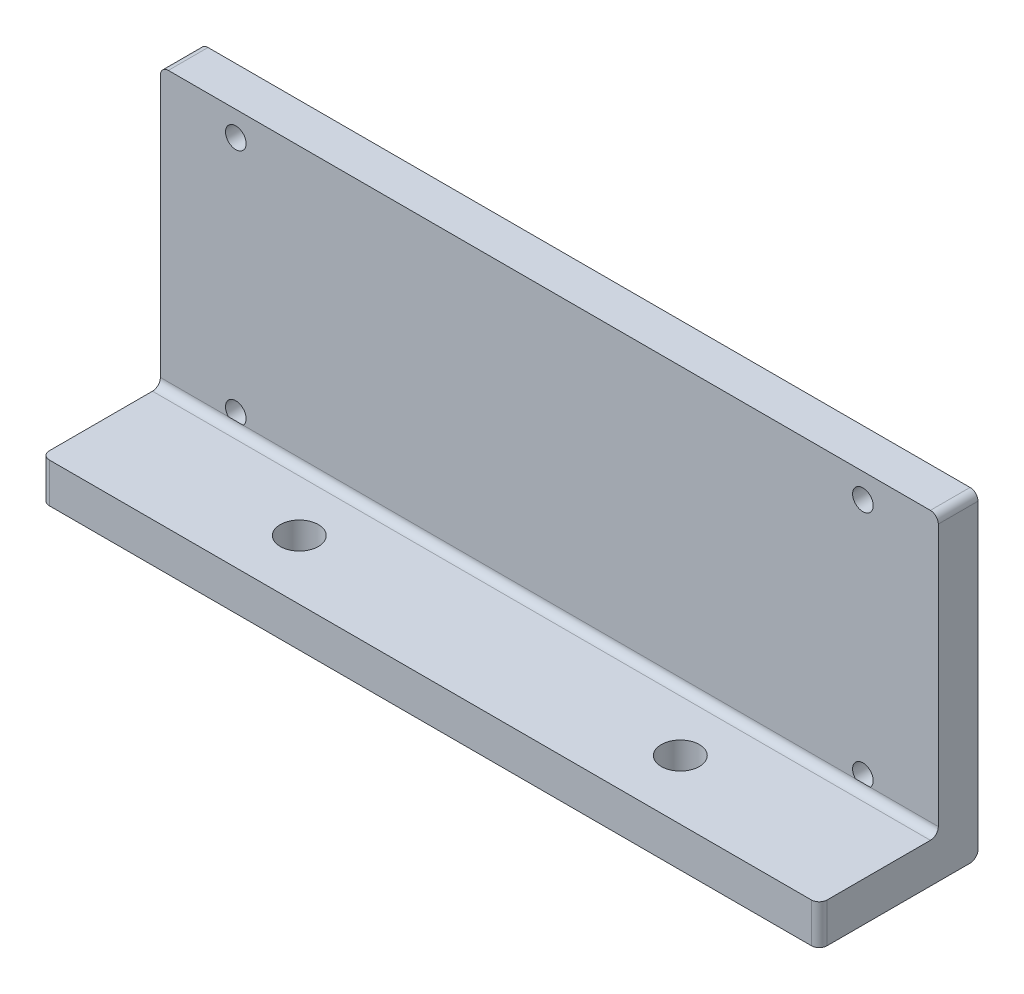
ISO-10303-21;
HEADER;
FILE_DESCRIPTION(('STEP AP214'),'2;1');
FILE_NAME('part.step','',(''),(''),'','','');
FILE_SCHEMA(('AUTOMOTIVE_DESIGN { 1 0 10303 214 1 1 1 1 }'));
ENDSEC;
DATA;
#1=APPLICATION_CONTEXT('core data for automotive mechanical design processes');
#2=APPLICATION_PROTOCOL_DEFINITION('international standard','automotive_design',2000,#1);
#3=PRODUCT_CONTEXT('',#1,'mechanical');
#4=PRODUCT('Part','Part','',(#3));
#5=PRODUCT_RELATED_PRODUCT_CATEGORY('part','',(#4));
#6=PRODUCT_DEFINITION_FORMATION('','',#4);
#7=PRODUCT_DEFINITION_CONTEXT('part definition',#1,'design');
#8=PRODUCT_DEFINITION('design','',#6,#7);
#9=PRODUCT_DEFINITION_SHAPE('','',#8);
#10=(LENGTH_UNIT() NAMED_UNIT(*) SI_UNIT(.MILLI.,.METRE.));
#11=(NAMED_UNIT(*) PLANE_ANGLE_UNIT() SI_UNIT($,.RADIAN.));
#12=(NAMED_UNIT(*) SI_UNIT($,.STERADIAN.) SOLID_ANGLE_UNIT());
#13=UNCERTAINTY_MEASURE_WITH_UNIT(LENGTH_MEASURE(1.E-05),#10,'distance_accuracy_value','');
#14=(GEOMETRIC_REPRESENTATION_CONTEXT(3) GLOBAL_UNCERTAINTY_ASSIGNED_CONTEXT((#13)) GLOBAL_UNIT_ASSIGNED_CONTEXT((#10,
#11,#12)) REPRESENTATION_CONTEXT('',''));
#15=CARTESIAN_POINT('',(0.,0.,0.));
#16=DIRECTION('',(0.,0.,1.));
#17=DIRECTION('',(1.,0.,0.));
#18=AXIS2_PLACEMENT_3D('',#15,#16,#17);
#19=CARTESIAN_POINT('',(0.,5.,0.));
#20=DIRECTION('',(0.,-1.,0.));
#21=DIRECTION('',(0.,0.,-1.));
#22=AXIS2_PLACEMENT_3D('',#19,#20,#21);
#23=PLANE('',#22);
#24=CARTESIAN_POINT('',(-24.,5.,2.5));
#25=DIRECTION('',(0.,1.,0.));
#26=DIRECTION('',(0.,0.,1.));
#27=AXIS2_PLACEMENT_3D('',#24,#25,#26);
#28=CIRCLE('',#27,2.4);
#29=CARTESIAN_POINT('',(-24.,5.,4.9));
#30=VERTEX_POINT('',#29);
#31=EDGE_CURVE('E309',#30,#30,#28,.T.);
#32=ORIENTED_EDGE('',*,*,#31,.F.);
#33=EDGE_LOOP('',(#32));
#34=FACE_BOUND('',#33,.T.);
#35=CARTESIAN_POINT('',(24.,5.,2.5));
#36=DIRECTION('',(0.,1.,0.));
#37=DIRECTION('',(0.,0.,1.));
#38=AXIS2_PLACEMENT_3D('',#35,#36,#37);
#39=CIRCLE('',#38,2.4);
#40=CARTESIAN_POINT('',(24.,5.,4.9));
#41=VERTEX_POINT('',#40);
#42=EDGE_CURVE('E303',#41,#41,#39,.T.);
#43=ORIENTED_EDGE('',*,*,#42,.F.);
#44=EDGE_LOOP('',(#43));
#45=FACE_BOUND('',#44,.T.);
#46=DIRECTION('',(1.,0.,0.));
#47=VECTOR('',#46,1.);
#48=CARTESIAN_POINT('',(-49.,5.,10.));
#49=LINE('',#48,#47);
#50=CARTESIAN_POINT('',(-48.,5.,10.));
#51=VERTEX_POINT('',#50);
#52=CARTESIAN_POINT('',(48.,5.,10.));
#53=VERTEX_POINT('',#52);
#54=EDGE_CURVE('E242',#51,#53,#49,.T.);
#55=ORIENTED_EDGE('',*,*,#54,.T.);
#56=CARTESIAN_POINT('',(48.,5.,9.));
#57=DIRECTION('',(0.,-1.,0.));
#58=DIRECTION('',(0.,0.,-1.));
#59=AXIS2_PLACEMENT_3D('',#56,#57,#58);
#60=CIRCLE('',#59,1.);
#61=CARTESIAN_POINT('',(49.,5.,9.));
#62=VERTEX_POINT('',#61);
#63=EDGE_CURVE('E204',#53,#62,#60,.F.);
#64=ORIENTED_EDGE('',*,*,#63,.T.);
#65=DIRECTION('',(0.,0.,-1.));
#66=VECTOR('',#65,1.);
#67=CARTESIAN_POINT('',(49.,5.,10.));
#68=LINE('',#67,#66);
#69=CARTESIAN_POINT('',(49.,5.,-4.));
#70=VERTEX_POINT('',#69);
#71=EDGE_CURVE('E211',#62,#70,#68,.T.);
#72=ORIENTED_EDGE('',*,*,#71,.T.);
#73=DIRECTION('',(1.,0.,0.));
#74=VECTOR('',#73,1.);
#75=CARTESIAN_POINT('',(-49.,5.,-3.99999999999999));
#76=LINE('',#75,#74);
#77=CARTESIAN_POINT('',(-49.,5.,-3.99999999999999));
#78=VERTEX_POINT('',#77);
#79=EDGE_CURVE('E200',#70,#78,#76,.F.);
#80=ORIENTED_EDGE('',*,*,#79,.T.);
#81=DIRECTION('',(0.,0.,1.));
#82=VECTOR('',#81,1.);
#83=CARTESIAN_POINT('',(-49.,5.,10.));
#84=LINE('',#83,#82);
#85=CARTESIAN_POINT('',(-49.,5.,9.));
#86=VERTEX_POINT('',#85);
#87=EDGE_CURVE('E221',#78,#86,#84,.T.);
#88=ORIENTED_EDGE('',*,*,#87,.T.);
#89=CARTESIAN_POINT('',(-48.,5.,9.));
#90=DIRECTION('',(0.,-1.,0.));
#91=DIRECTION('',(0.,0.,-1.));
#92=AXIS2_PLACEMENT_3D('',#89,#90,#91);
#93=CIRCLE('',#92,1.);
#94=EDGE_CURVE('E202',#86,#51,#93,.F.);
#95=ORIENTED_EDGE('',*,*,#94,.T.);
#96=EDGE_LOOP('',(#55,#64,#72,#80,#88,#95));
#97=FACE_BOUND('',#96,.T.);
#98=ADVANCED_FACE('F37',(#34,#45,#97),#23,.F.);
#99=CARTESIAN_POINT('',(49.,5.,10.));
#100=DIRECTION('',(-1.,0.,0.));
#101=DIRECTION('',(0.,0.,1.));
#102=AXIS2_PLACEMENT_3D('',#99,#100,#101);
#103=PLANE('',#102);
#104=DIRECTION('',(0.,-1.,0.));
#105=VECTOR('',#104,1.);
#106=CARTESIAN_POINT('',(49.,5.,-10.));
#107=LINE('',#106,#105);
#108=CARTESIAN_POINT('',(49.,39.,-10.));
#109=VERTEX_POINT('',#108);
#110=CARTESIAN_POINT('',(49.,1.,-10.));
#111=VERTEX_POINT('',#110);
#112=EDGE_CURVE('E251',#109,#111,#107,.T.);
#113=ORIENTED_EDGE('',*,*,#112,.F.);
#114=DIRECTION('',(0.,0.,-1.));
#115=VECTOR('',#114,1.);
#116=CARTESIAN_POINT('',(49.,39.,10.));
#117=LINE('',#116,#115);
#118=CARTESIAN_POINT('',(49.,39.,-5.));
#119=VERTEX_POINT('',#118);
#120=EDGE_CURVE('E187',#109,#119,#117,.F.);
#121=ORIENTED_EDGE('',*,*,#120,.T.);
#122=DIRECTION('',(0.,-1.,0.));
#123=VECTOR('',#122,1.);
#124=CARTESIAN_POINT('',(49.,40.,-5.));
#125=LINE('',#124,#123);
#126=CARTESIAN_POINT('',(49.,6.,-5.));
#127=VERTEX_POINT('',#126);
#128=EDGE_CURVE('E214',#119,#127,#125,.T.);
#129=ORIENTED_EDGE('',*,*,#128,.T.);
#130=CARTESIAN_POINT('',(49.,6.,-4.));
#131=DIRECTION('',(-1.,0.,0.));
#132=DIRECTION('',(0.,0.,1.));
#133=AXIS2_PLACEMENT_3D('',#130,#131,#132);
#134=CIRCLE('',#133,1.);
#135=EDGE_CURVE('E45',#127,#70,#134,.T.);
#136=ORIENTED_EDGE('',*,*,#135,.T.);
#137=ORIENTED_EDGE('',*,*,#71,.F.);
#138=DIRECTION('',(0.,-1.,0.));
#139=VECTOR('',#138,1.);
#140=CARTESIAN_POINT('',(49.,5.,9.));
#141=LINE('',#140,#139);
#142=CARTESIAN_POINT('',(49.,0.,9.));
#143=VERTEX_POINT('',#142);
#144=EDGE_CURVE('E184',#62,#143,#141,.T.);
#145=ORIENTED_EDGE('',*,*,#144,.T.);
#146=DIRECTION('',(0.,0.,-1.));
#147=VECTOR('',#146,1.);
#148=CARTESIAN_POINT('',(49.,0.,10.));
#149=LINE('',#148,#147);
#150=CARTESIAN_POINT('',(49.,0.,-9.));
#151=VERTEX_POINT('',#150);
#152=EDGE_CURVE('E232',#143,#151,#149,.T.);
#153=ORIENTED_EDGE('',*,*,#152,.T.);
#154=CARTESIAN_POINT('',(49.,1.,-9.));
#155=DIRECTION('',(-1.,0.,0.));
#156=DIRECTION('',(0.,0.,1.));
#157=AXIS2_PLACEMENT_3D('',#154,#155,#156);
#158=CIRCLE('',#157,1.);
#159=EDGE_CURVE('E182',#151,#111,#158,.F.);
#160=ORIENTED_EDGE('',*,*,#159,.T.);
#161=EDGE_LOOP('',(#113,#121,#129,#136,#137,#145,#153,#160));
#162=FACE_BOUND('',#161,.T.);
#163=ADVANCED_FACE('F210',(#162),#103,.F.);
#164=CARTESIAN_POINT('',(-49.,5.,-10.));
#165=DIRECTION('',(0.,0.,1.));
#166=DIRECTION('',(1.,0.,0.));
#167=AXIS2_PLACEMENT_3D('',#164,#165,#166);
#168=PLANE('',#167);
#169=CARTESIAN_POINT('',(39.4999999999999,36.904051391417,-10.));
#170=DIRECTION('',(0.,0.,1.));
#171=DIRECTION('',(1.,0.,0.));
#172=AXIS2_PLACEMENT_3D('',#169,#170,#171);
#173=CIRCLE('',#172,1.3);
#174=CARTESIAN_POINT('',(40.7999999999999,36.904051391417,-10.));
#175=VERTEX_POINT('',#174);
#176=EDGE_CURVE('E140',#175,#175,#173,.T.);
#177=ORIENTED_EDGE('',*,*,#176,.T.);
#178=EDGE_LOOP('',(#177));
#179=FACE_BOUND('',#178,.T.);
#180=CARTESIAN_POINT('',(39.5000000000002,6.90405139141699,-10.));
#181=DIRECTION('',(0.,0.,1.));
#182=DIRECTION('',(1.,0.,0.));
#183=AXIS2_PLACEMENT_3D('',#180,#181,#182);
#184=CIRCLE('',#183,1.3);
#185=CARTESIAN_POINT('',(40.8000000000002,6.90405139141699,-10.));
#186=VERTEX_POINT('',#185);
#187=EDGE_CURVE('E146',#186,#186,#184,.T.);
#188=ORIENTED_EDGE('',*,*,#187,.T.);
#189=EDGE_LOOP('',(#188));
#190=FACE_BOUND('',#189,.T.);
#191=CARTESIAN_POINT('',(-39.5000000000002,36.9040513914162,-10.));
#192=DIRECTION('',(0.,0.,1.));
#193=DIRECTION('',(1.,0.,0.));
#194=AXIS2_PLACEMENT_3D('',#191,#192,#193);
#195=CIRCLE('',#194,1.3);
#196=CARTESIAN_POINT('',(-38.2000000000002,36.9040513914162,-10.));
#197=VERTEX_POINT('',#196);
#198=EDGE_CURVE('E287',#197,#197,#195,.T.);
#199=ORIENTED_EDGE('',*,*,#198,.T.);
#200=EDGE_LOOP('',(#199));
#201=FACE_BOUND('',#200,.T.);
#202=CARTESIAN_POINT('',(-39.4999999999999,6.90405139141616,-10.));
#203=DIRECTION('',(0.,0.,1.));
#204=DIRECTION('',(1.,0.,0.));
#205=AXIS2_PLACEMENT_3D('',#202,#203,#204);
#206=CIRCLE('',#205,1.3);
#207=CARTESIAN_POINT('',(-38.1999999999999,6.90405139141616,-10.));
#208=VERTEX_POINT('',#207);
#209=EDGE_CURVE('E281',#208,#208,#206,.T.);
#210=ORIENTED_EDGE('',*,*,#209,.T.);
#211=EDGE_LOOP('',(#210));
#212=FACE_BOUND('',#211,.T.);
#213=DIRECTION('',(0.,-1.,0.));
#214=VECTOR('',#213,1.);
#215=CARTESIAN_POINT('',(-49.,5.,-10.));
#216=LINE('',#215,#214);
#217=CARTESIAN_POINT('',(-49.,39.,-10.));
#218=VERTEX_POINT('',#217);
#219=CARTESIAN_POINT('',(-49.,1.,-10.));
#220=VERTEX_POINT('',#219);
#221=EDGE_CURVE('E243',#218,#220,#216,.T.);
#222=ORIENTED_EDGE('',*,*,#221,.F.);
#223=CARTESIAN_POINT('',(-48.,39.,-10.));
#224=DIRECTION('',(0.,0.,1.));
#225=DIRECTION('',(1.,0.,0.));
#226=AXIS2_PLACEMENT_3D('',#223,#224,#225);
#227=CIRCLE('',#226,1.);
#228=CARTESIAN_POINT('',(-48.,40.,-9.99999999999999));
#229=VERTEX_POINT('',#228);
#230=EDGE_CURVE('E180',#218,#229,#227,.F.);
#231=ORIENTED_EDGE('',*,*,#230,.T.);
#232=DIRECTION('',(-1.,0.,0.));
#233=VECTOR('',#232,1.);
#234=CARTESIAN_POINT('',(49.,40.,-10.));
#235=LINE('',#234,#233);
#236=CARTESIAN_POINT('',(48.,40.,-10.));
#237=VERTEX_POINT('',#236);
#238=EDGE_CURVE('E270',#237,#229,#235,.T.);
#239=ORIENTED_EDGE('',*,*,#238,.F.);
#240=CARTESIAN_POINT('',(48.,39.,-10.));
#241=DIRECTION('',(0.,0.,1.));
#242=DIRECTION('',(1.,0.,0.));
#243=AXIS2_PLACEMENT_3D('',#240,#241,#242);
#244=CIRCLE('',#243,1.);
#245=EDGE_CURVE('E178',#237,#109,#244,.F.);
#246=ORIENTED_EDGE('',*,*,#245,.T.);
#247=ORIENTED_EDGE('',*,*,#112,.T.);
#248=DIRECTION('',(-1.,0.,0.));
#249=VECTOR('',#248,1.);
#250=CARTESIAN_POINT('',(-49.,1.,-10.));
#251=LINE('',#250,#249);
#252=EDGE_CURVE('E175',#111,#220,#251,.T.);
#253=ORIENTED_EDGE('',*,*,#252,.T.);
#254=EDGE_LOOP('',(#222,#231,#239,#246,#247,#253));
#255=FACE_BOUND('',#254,.T.);
#256=ADVANCED_FACE('F268',(#179,#190,#201,#212,#255),#168,.F.);
#257=CARTESIAN_POINT('',(-49.,5.,10.));
#258=DIRECTION('',(1.,0.,0.));
#259=DIRECTION('',(0.,0.,-1.));
#260=AXIS2_PLACEMENT_3D('',#257,#258,#259);
#261=PLANE('',#260);
#262=DIRECTION('',(0.,-1.,0.));
#263=VECTOR('',#262,1.);
#264=CARTESIAN_POINT('',(-49.,40.,-4.99999999999999));
#265=LINE('',#264,#263);
#266=CARTESIAN_POINT('',(-49.,39.,-4.99999999999999));
#267=VERTEX_POINT('',#266);
#268=CARTESIAN_POINT('',(-49.,6.,-4.99999999999999));
#269=VERTEX_POINT('',#268);
#270=EDGE_CURVE('E229',#267,#269,#265,.T.);
#271=ORIENTED_EDGE('',*,*,#270,.F.);
#272=DIRECTION('',(0.,0.,1.));
#273=VECTOR('',#272,1.);
#274=CARTESIAN_POINT('',(-49.,39.,10.));
#275=LINE('',#274,#273);
#276=EDGE_CURVE('E173',#267,#218,#275,.F.);
#277=ORIENTED_EDGE('',*,*,#276,.T.);
#278=ORIENTED_EDGE('',*,*,#221,.T.);
#279=CARTESIAN_POINT('',(-49.,1.,-9.));
#280=DIRECTION('',(1.,0.,0.));
#281=DIRECTION('',(0.,0.,-1.));
#282=AXIS2_PLACEMENT_3D('',#279,#280,#281);
#283=CIRCLE('',#282,1.);
#284=CARTESIAN_POINT('',(-49.,0.,-9.));
#285=VERTEX_POINT('',#284);
#286=EDGE_CURVE('E169',#220,#285,#283,.F.);
#287=ORIENTED_EDGE('',*,*,#286,.T.);
#288=DIRECTION('',(0.,0.,1.));
#289=VECTOR('',#288,1.);
#290=CARTESIAN_POINT('',(-49.,0.,10.));
#291=LINE('',#290,#289);
#292=CARTESIAN_POINT('',(-49.,0.,9.));
#293=VERTEX_POINT('',#292);
#294=EDGE_CURVE('E235',#285,#293,#291,.T.);
#295=ORIENTED_EDGE('',*,*,#294,.T.);
#296=DIRECTION('',(0.,-1.,0.));
#297=VECTOR('',#296,1.);
#298=CARTESIAN_POINT('',(-49.,5.,9.));
#299=LINE('',#298,#297);
#300=EDGE_CURVE('E171',#293,#86,#299,.F.);
#301=ORIENTED_EDGE('',*,*,#300,.T.);
#302=ORIENTED_EDGE('',*,*,#87,.F.);
#303=CARTESIAN_POINT('',(-49.,6.,-3.99999999999999));
#304=DIRECTION('',(1.,0.,0.));
#305=DIRECTION('',(0.,0.,-1.));
#306=AXIS2_PLACEMENT_3D('',#303,#304,#305);
#307=CIRCLE('',#306,1.);
#308=EDGE_CURVE('E11',#78,#269,#307,.T.);
#309=ORIENTED_EDGE('',*,*,#308,.T.);
#310=EDGE_LOOP('',(#271,#277,#278,#287,#295,#301,#302,#309));
#311=FACE_BOUND('',#310,.T.);
#312=ADVANCED_FACE('F228',(#311),#261,.F.);
#313=CARTESIAN_POINT('',(-49.,5.,10.));
#314=DIRECTION('',(0.,0.,-1.));
#315=DIRECTION('',(-1.,0.,0.));
#316=AXIS2_PLACEMENT_3D('',#313,#314,#315);
#317=PLANE('',#316);
#318=DIRECTION('',(1.,0.,0.));
#319=VECTOR('',#318,1.);
#320=CARTESIAN_POINT('',(-49.,0.,10.));
#321=LINE('',#320,#319);
#322=CARTESIAN_POINT('',(-48.,0.,10.));
#323=VERTEX_POINT('',#322);
#324=CARTESIAN_POINT('',(48.,0.,10.));
#325=VERTEX_POINT('',#324);
#326=EDGE_CURVE('E222',#323,#325,#321,.T.);
#327=ORIENTED_EDGE('',*,*,#326,.T.);
#328=DIRECTION('',(0.,-1.,0.));
#329=VECTOR('',#328,1.);
#330=CARTESIAN_POINT('',(48.,5.,10.));
#331=LINE('',#330,#329);
#332=EDGE_CURVE('E198',#325,#53,#331,.F.);
#333=ORIENTED_EDGE('',*,*,#332,.T.);
#334=ORIENTED_EDGE('',*,*,#54,.F.);
#335=DIRECTION('',(0.,-1.,0.));
#336=VECTOR('',#335,1.);
#337=CARTESIAN_POINT('',(-48.,5.,10.));
#338=LINE('',#337,#336);
#339=EDGE_CURVE('E195',#51,#323,#338,.T.);
#340=ORIENTED_EDGE('',*,*,#339,.T.);
#341=EDGE_LOOP('',(#327,#333,#334,#340));
#342=FACE_BOUND('',#341,.T.);
#343=ADVANCED_FACE('F359',(#342),#317,.F.);
#344=CARTESIAN_POINT('',(0.,0.,0.));
#345=DIRECTION('',(0.,-1.,0.));
#346=DIRECTION('',(0.,0.,-1.));
#347=AXIS2_PLACEMENT_3D('',#344,#345,#346);
#348=PLANE('',#347);
#349=CARTESIAN_POINT('',(-24.,0.,2.5));
#350=DIRECTION('',(0.,1.,0.));
#351=DIRECTION('',(0.,0.,1.));
#352=AXIS2_PLACEMENT_3D('',#349,#350,#351);
#353=CIRCLE('',#352,2.4);
#354=CARTESIAN_POINT('',(-24.,0.,4.9));
#355=VERTEX_POINT('',#354);
#356=EDGE_CURVE('E306',#355,#355,#353,.T.);
#357=ORIENTED_EDGE('',*,*,#356,.T.);
#358=EDGE_LOOP('',(#357));
#359=FACE_BOUND('',#358,.T.);
#360=CARTESIAN_POINT('',(24.,0.,2.5));
#361=DIRECTION('',(0.,1.,0.));
#362=DIRECTION('',(0.,0.,1.));
#363=AXIS2_PLACEMENT_3D('',#360,#361,#362);
#364=CIRCLE('',#363,2.4);
#365=CARTESIAN_POINT('',(24.,0.,4.9));
#366=VERTEX_POINT('',#365);
#367=EDGE_CURVE('E300',#366,#366,#364,.T.);
#368=ORIENTED_EDGE('',*,*,#367,.T.);
#369=EDGE_LOOP('',(#368));
#370=FACE_BOUND('',#369,.T.);
#371=ORIENTED_EDGE('',*,*,#152,.F.);
#372=CARTESIAN_POINT('',(48.,0.,9.));
#373=DIRECTION('',(0.,-1.,0.));
#374=DIRECTION('',(0.,0.,-1.));
#375=AXIS2_PLACEMENT_3D('',#372,#373,#374);
#376=CIRCLE('',#375,1.);
#377=EDGE_CURVE('E193',#143,#325,#376,.T.);
#378=ORIENTED_EDGE('',*,*,#377,.T.);
#379=ORIENTED_EDGE('',*,*,#326,.F.);
#380=CARTESIAN_POINT('',(-48.,0.,9.));
#381=DIRECTION('',(0.,-1.,0.));
#382=DIRECTION('',(0.,0.,-1.));
#383=AXIS2_PLACEMENT_3D('',#380,#381,#382);
#384=CIRCLE('',#383,1.);
#385=EDGE_CURVE('E191',#323,#293,#384,.T.);
#386=ORIENTED_EDGE('',*,*,#385,.T.);
#387=ORIENTED_EDGE('',*,*,#294,.F.);
#388=DIRECTION('',(-1.,0.,0.));
#389=VECTOR('',#388,1.);
#390=CARTESIAN_POINT('',(49.,0.,-9.));
#391=LINE('',#390,#389);
#392=EDGE_CURVE('E189',#285,#151,#391,.F.);
#393=ORIENTED_EDGE('',*,*,#392,.T.);
#394=EDGE_LOOP('',(#371,#378,#379,#386,#387,#393));
#395=FACE_BOUND('',#394,.T.);
#396=ADVANCED_FACE('F354',(#359,#370,#395),#348,.T.);
#397=CARTESIAN_POINT('',(49.,40.,-5.));
#398=DIRECTION('',(0.,0.,-1.));
#399=DIRECTION('',(-1.,0.,0.));
#400=AXIS2_PLACEMENT_3D('',#397,#398,#399);
#401=PLANE('',#400);
#402=CARTESIAN_POINT('',(39.4999999999999,36.904051391417,-4.99999999999999));
#403=DIRECTION('',(0.,0.,1.));
#404=DIRECTION('',(1.,0.,0.));
#405=AXIS2_PLACEMENT_3D('',#402,#403,#404);
#406=CIRCLE('',#405,1.3);
#407=CARTESIAN_POINT('',(40.7999999999999,36.904051391417,-4.99999999999999));
#408=VERTEX_POINT('',#407);
#409=EDGE_CURVE('E297',#408,#408,#406,.T.);
#410=ORIENTED_EDGE('',*,*,#409,.F.);
#411=EDGE_LOOP('',(#410));
#412=FACE_BOUND('',#411,.T.);
#413=CARTESIAN_POINT('',(-39.5000000000002,36.9040513914162,-4.99999999999999));
#414=DIRECTION('',(0.,0.,1.));
#415=DIRECTION('',(1.,0.,0.));
#416=AXIS2_PLACEMENT_3D('',#413,#414,#415);
#417=CIRCLE('',#416,1.3);
#418=CARTESIAN_POINT('',(-38.2000000000002,36.9040513914162,-4.99999999999999));
#419=VERTEX_POINT('',#418);
#420=EDGE_CURVE('E290',#419,#419,#417,.T.);
#421=ORIENTED_EDGE('',*,*,#420,.F.);
#422=EDGE_LOOP('',(#421));
#423=FACE_BOUND('',#422,.T.);
#424=DIRECTION('',(1.,0.,0.));
#425=VECTOR('',#424,1.);
#426=CARTESIAN_POINT('',(49.,6.,-5.));
#427=LINE('',#426,#425);
#428=CARTESIAN_POINT('',(-38.5658206373085,6.,-4.99999999999999));
#429=VERTEX_POINT('',#428);
#430=CARTESIAN_POINT('',(38.5658206373096,6.,-4.99999999999999));
#431=VERTEX_POINT('',#430);
#432=EDGE_CURVE('E151',#429,#431,#427,.T.);
#433=ORIENTED_EDGE('',*,*,#432,.T.);
#434=CARTESIAN_POINT('',(39.5000000000002,6.90405139141699,-4.99999999999999));
#435=DIRECTION('',(0.,0.,1.));
#436=DIRECTION('',(1.,0.,0.));
#437=AXIS2_PLACEMENT_3D('',#434,#435,#436);
#438=CIRCLE('',#437,1.3);
#439=CARTESIAN_POINT('',(40.4341793626908,6.,-5.));
#440=VERTEX_POINT('',#439);
#441=EDGE_CURVE('E135',#440,#431,#438,.T.);
#442=ORIENTED_EDGE('',*,*,#441,.F.);
#443=EDGE_CURVE('E153',#440,#127,#427,.T.);
#444=ORIENTED_EDGE('',*,*,#443,.T.);
#445=ORIENTED_EDGE('',*,*,#128,.F.);
#446=CARTESIAN_POINT('',(48.,39.,-5.));
#447=DIRECTION('',(0.,0.,-1.));
#448=DIRECTION('',(-1.,0.,0.));
#449=AXIS2_PLACEMENT_3D('',#446,#447,#448);
#450=CIRCLE('',#449,1.);
#451=CARTESIAN_POINT('',(48.,40.,-5.));
#452=VERTEX_POINT('',#451);
#453=EDGE_CURVE('E163',#119,#452,#450,.F.);
#454=ORIENTED_EDGE('',*,*,#453,.T.);
#455=DIRECTION('',(1.,0.,0.));
#456=VECTOR('',#455,1.);
#457=CARTESIAN_POINT('',(49.,40.,-5.));
#458=LINE('',#457,#456);
#459=CARTESIAN_POINT('',(-48.,40.,-4.99999999999999));
#460=VERTEX_POINT('',#459);
#461=EDGE_CURVE('E237',#460,#452,#458,.T.);
#462=ORIENTED_EDGE('',*,*,#461,.F.);
#463=CARTESIAN_POINT('',(-48.,39.,-4.99999999999999));
#464=DIRECTION('',(0.,0.,-1.));
#465=DIRECTION('',(-1.,0.,0.));
#466=AXIS2_PLACEMENT_3D('',#463,#464,#465);
#467=CIRCLE('',#466,1.);
#468=EDGE_CURVE('E167',#460,#267,#467,.F.);
#469=ORIENTED_EDGE('',*,*,#468,.T.);
#470=ORIENTED_EDGE('',*,*,#270,.T.);
#471=CARTESIAN_POINT('',(-40.4341793626913,6.,-4.99999999999999));
#472=VERTEX_POINT('',#471);
#473=EDGE_CURVE('E160',#269,#472,#427,.T.);
#474=ORIENTED_EDGE('',*,*,#473,.T.);
#475=CARTESIAN_POINT('',(-39.4999999999999,6.90405139141616,-4.99999999999999));
#476=DIRECTION('',(0.,0.,1.));
#477=DIRECTION('',(1.,0.,0.));
#478=AXIS2_PLACEMENT_3D('',#475,#476,#477);
#479=CIRCLE('',#478,1.3);
#480=EDGE_CURVE('E158',#429,#472,#479,.T.);
#481=ORIENTED_EDGE('',*,*,#480,.F.);
#482=EDGE_LOOP('',(#433,#442,#444,#445,#454,#462,#469,#470,#474,#481));
#483=FACE_BOUND('',#482,.T.);
#484=ADVANCED_FACE('F156',(#412,#423,#483),#401,.F.);
#485=CARTESIAN_POINT('',(0.,40.,0.));
#486=DIRECTION('',(0.,-1.,0.));
#487=DIRECTION('',(0.,0.,-1.));
#488=AXIS2_PLACEMENT_3D('',#485,#486,#487);
#489=PLANE('',#488);
#490=ORIENTED_EDGE('',*,*,#238,.T.);
#491=DIRECTION('',(0.,0.,1.));
#492=VECTOR('',#491,1.);
#493=CARTESIAN_POINT('',(-48.,40.,0.));
#494=LINE('',#493,#492);
#495=EDGE_CURVE('E164',#229,#460,#494,.T.);
#496=ORIENTED_EDGE('',*,*,#495,.T.);
#497=ORIENTED_EDGE('',*,*,#461,.T.);
#498=DIRECTION('',(0.,0.,-1.));
#499=VECTOR('',#498,1.);
#500=CARTESIAN_POINT('',(48.,40.,0.));
#501=LINE('',#500,#499);
#502=EDGE_CURVE('E253',#452,#237,#501,.T.);
#503=ORIENTED_EDGE('',*,*,#502,.T.);
#504=EDGE_LOOP('',(#490,#496,#497,#503));
#505=FACE_BOUND('',#504,.T.);
#506=ADVANCED_FACE('F280',(#505),#489,.F.);
#507=CARTESIAN_POINT('',(-48.,39.,0.));
#508=DIRECTION('',(0.,0.,1.));
#509=DIRECTION('',(1.,0.,0.));
#510=AXIS2_PLACEMENT_3D('',#507,#508,#509);
#511=CYLINDRICAL_SURFACE('',#510,1.);
#512=ORIENTED_EDGE('',*,*,#230,.F.);
#513=ORIENTED_EDGE('',*,*,#276,.F.);
#514=ORIENTED_EDGE('',*,*,#468,.F.);
#515=ORIENTED_EDGE('',*,*,#495,.F.);
#516=EDGE_LOOP('',(#512,#513,#514,#515));
#517=FACE_BOUND('',#516,.T.);
#518=ADVANCED_FACE('F279',(#517),#511,.T.);
#519=CARTESIAN_POINT('',(48.,39.,0.));
#520=DIRECTION('',(0.,0.,-1.));
#521=DIRECTION('',(-1.,0.,0.));
#522=AXIS2_PLACEMENT_3D('',#519,#520,#521);
#523=CYLINDRICAL_SURFACE('',#522,1.);
#524=ORIENTED_EDGE('',*,*,#453,.F.);
#525=ORIENTED_EDGE('',*,*,#120,.F.);
#526=ORIENTED_EDGE('',*,*,#245,.F.);
#527=ORIENTED_EDGE('',*,*,#502,.F.);
#528=EDGE_LOOP('',(#524,#525,#526,#527));
#529=FACE_BOUND('',#528,.T.);
#530=ADVANCED_FACE('F265',(#529),#523,.T.);
#531=CARTESIAN_POINT('',(48.,5.,9.));
#532=DIRECTION('',(0.,-1.,0.));
#533=DIRECTION('',(0.,0.,-1.));
#534=AXIS2_PLACEMENT_3D('',#531,#532,#533);
#535=CYLINDRICAL_SURFACE('',#534,1.);
#536=ORIENTED_EDGE('',*,*,#63,.F.);
#537=ORIENTED_EDGE('',*,*,#332,.F.);
#538=ORIENTED_EDGE('',*,*,#377,.F.);
#539=ORIENTED_EDGE('',*,*,#144,.F.);
#540=EDGE_LOOP('',(#536,#537,#538,#539));
#541=FACE_BOUND('',#540,.T.);
#542=ADVANCED_FACE('F375',(#541),#535,.T.);
#543=CARTESIAN_POINT('',(-48.,5.,9.));
#544=DIRECTION('',(0.,-1.,0.));
#545=DIRECTION('',(0.,0.,-1.));
#546=AXIS2_PLACEMENT_3D('',#543,#544,#545);
#547=CYLINDRICAL_SURFACE('',#546,1.);
#548=ORIENTED_EDGE('',*,*,#94,.F.);
#549=ORIENTED_EDGE('',*,*,#300,.F.);
#550=ORIENTED_EDGE('',*,*,#385,.F.);
#551=ORIENTED_EDGE('',*,*,#339,.F.);
#552=EDGE_LOOP('',(#548,#549,#550,#551));
#553=FACE_BOUND('',#552,.T.);
#554=ADVANCED_FACE('F378',(#553),#547,.T.);
#555=CARTESIAN_POINT('',(-49.,1.,-9.));
#556=DIRECTION('',(1.,0.,0.));
#557=DIRECTION('',(0.,0.,-1.));
#558=AXIS2_PLACEMENT_3D('',#555,#556,#557);
#559=CYLINDRICAL_SURFACE('',#558,1.);
#560=ORIENTED_EDGE('',*,*,#159,.F.);
#561=ORIENTED_EDGE('',*,*,#392,.F.);
#562=ORIENTED_EDGE('',*,*,#286,.F.);
#563=ORIENTED_EDGE('',*,*,#252,.F.);
#564=EDGE_LOOP('',(#560,#561,#562,#563));
#565=FACE_BOUND('',#564,.T.);
#566=ADVANCED_FACE('F275',(#565),#559,.T.);
#567=CARTESIAN_POINT('',(49.,6.,-4.));
#568=DIRECTION('',(-1.,0.,0.));
#569=DIRECTION('',(0.,0.,1.));
#570=AXIS2_PLACEMENT_3D('',#567,#568,#569);
#571=CYLINDRICAL_SURFACE('',#570,1.);
#572=ORIENTED_EDGE('',*,*,#308,.F.);
#573=ORIENTED_EDGE('',*,*,#79,.F.);
#574=ORIENTED_EDGE('',*,*,#135,.F.);
#575=ORIENTED_EDGE('',*,*,#443,.F.);
#576=EDGE_CURVE('E145',#431,#440,#427,.T.);
#577=ORIENTED_EDGE('',*,*,#576,.F.);
#578=ORIENTED_EDGE('',*,*,#432,.F.);
#579=EDGE_CURVE('E159',#472,#429,#427,.T.);
#580=ORIENTED_EDGE('',*,*,#579,.F.);
#581=ORIENTED_EDGE('',*,*,#473,.F.);
#582=EDGE_LOOP('',(#572,#573,#574,#575,#577,#578,#580,#581));
#583=FACE_BOUND('',#582,.T.);
#584=ADVANCED_FACE('F39',(#583),#571,.F.);
#585=CARTESIAN_POINT('',(-38.1999999999999,6.90405139141616,-4.99999999999999));
#586=DIRECTION('',(0.,0.,1.));
#587=DIRECTION('',(1.,0.,0.));
#588=AXIS2_PLACEMENT_3D('',#585,#586,#587);
#589=PLANE('',#588);
#590=ORIENTED_EDGE('',*,*,#579,.T.);
#591=EDGE_CURVE('E58',#472,#429,#479,.T.);
#592=ORIENTED_EDGE('',*,*,#591,.F.);
#593=EDGE_LOOP('',(#590,#592));
#594=FACE_BOUND('',#593,.T.);
#595=ADVANCED_FACE('F347',(#594),#589,.F.);
#596=CARTESIAN_POINT('',(-39.4999999999999,6.90405139141616,-4.99999999999999));
#597=DIRECTION('',(0.,0.,1.));
#598=DIRECTION('',(1.,0.,0.));
#599=AXIS2_PLACEMENT_3D('',#596,#597,#598);
#600=CYLINDRICAL_SURFACE('',#599,1.3);
#601=ORIENTED_EDGE('',*,*,#209,.F.);
#602=EDGE_LOOP('',(#601));
#603=FACE_BOUND('',#602,.T.);
#604=ORIENTED_EDGE('',*,*,#591,.T.);
#605=ORIENTED_EDGE('',*,*,#480,.T.);
#606=EDGE_LOOP('',(#604,#605));
#607=FACE_BOUND('',#606,.T.);
#608=ADVANCED_FACE('F343',(#603,#607),#600,.F.);
#609=CARTESIAN_POINT('',(-39.5000000000002,36.9040513914162,-4.99999999999999));
#610=DIRECTION('',(0.,0.,1.));
#611=DIRECTION('',(1.,0.,0.));
#612=AXIS2_PLACEMENT_3D('',#609,#610,#611);
#613=CYLINDRICAL_SURFACE('',#612,1.3);
#614=ORIENTED_EDGE('',*,*,#198,.F.);
#615=EDGE_LOOP('',(#614));
#616=FACE_BOUND('',#615,.T.);
#617=ORIENTED_EDGE('',*,*,#420,.T.);
#618=EDGE_LOOP('',(#617));
#619=FACE_BOUND('',#618,.T.);
#620=ADVANCED_FACE('F340',(#616,#619),#613,.F.);
#621=CARTESIAN_POINT('',(40.8000000000002,6.90405139141699,-4.99999999999999));
#622=DIRECTION('',(0.,0.,1.));
#623=DIRECTION('',(1.,0.,0.));
#624=AXIS2_PLACEMENT_3D('',#621,#622,#623);
#625=PLANE('',#624);
#626=ORIENTED_EDGE('',*,*,#576,.T.);
#627=EDGE_CURVE('E51',#431,#440,#438,.T.);
#628=ORIENTED_EDGE('',*,*,#627,.F.);
#629=EDGE_LOOP('',(#626,#628));
#630=FACE_BOUND('',#629,.T.);
#631=ADVANCED_FACE('F144',(#630),#625,.F.);
#632=CARTESIAN_POINT('',(39.5000000000002,6.90405139141699,-4.99999999999999));
#633=DIRECTION('',(0.,0.,1.));
#634=DIRECTION('',(1.,0.,0.));
#635=AXIS2_PLACEMENT_3D('',#632,#633,#634);
#636=CYLINDRICAL_SURFACE('',#635,1.3);
#637=ORIENTED_EDGE('',*,*,#187,.F.);
#638=EDGE_LOOP('',(#637));
#639=FACE_BOUND('',#638,.T.);
#640=ORIENTED_EDGE('',*,*,#627,.T.);
#641=ORIENTED_EDGE('',*,*,#441,.T.);
#642=EDGE_LOOP('',(#640,#641));
#643=FACE_BOUND('',#642,.T.);
#644=ADVANCED_FACE('F136',(#639,#643),#636,.F.);
#645=CARTESIAN_POINT('',(39.4999999999999,36.904051391417,-4.99999999999999));
#646=DIRECTION('',(0.,0.,1.));
#647=DIRECTION('',(1.,0.,0.));
#648=AXIS2_PLACEMENT_3D('',#645,#646,#647);
#649=CYLINDRICAL_SURFACE('',#648,1.3);
#650=ORIENTED_EDGE('',*,*,#176,.F.);
#651=EDGE_LOOP('',(#650));
#652=FACE_BOUND('',#651,.T.);
#653=ORIENTED_EDGE('',*,*,#409,.T.);
#654=EDGE_LOOP('',(#653));
#655=FACE_BOUND('',#654,.T.);
#656=ADVANCED_FACE('F322',(#652,#655),#649,.F.);
#657=CARTESIAN_POINT('',(24.,5.,2.5));
#658=DIRECTION('',(0.,1.,0.));
#659=DIRECTION('',(0.,0.,1.));
#660=AXIS2_PLACEMENT_3D('',#657,#658,#659);
#661=CYLINDRICAL_SURFACE('',#660,2.4);
#662=ORIENTED_EDGE('',*,*,#367,.F.);
#663=EDGE_LOOP('',(#662));
#664=FACE_BOUND('',#663,.T.);
#665=ORIENTED_EDGE('',*,*,#42,.T.);
#666=EDGE_LOOP('',(#665));
#667=FACE_BOUND('',#666,.T.);
#668=ADVANCED_FACE('F320',(#664,#667),#661,.F.);
#669=CARTESIAN_POINT('',(-24.,5.,2.5));
#670=DIRECTION('',(0.,1.,0.));
#671=DIRECTION('',(0.,0.,1.));
#672=AXIS2_PLACEMENT_3D('',#669,#670,#671);
#673=CYLINDRICAL_SURFACE('',#672,2.4);
#674=ORIENTED_EDGE('',*,*,#356,.F.);
#675=EDGE_LOOP('',(#674));
#676=FACE_BOUND('',#675,.T.);
#677=ORIENTED_EDGE('',*,*,#31,.T.);
#678=EDGE_LOOP('',(#677));
#679=FACE_BOUND('',#678,.T.);
#680=ADVANCED_FACE('F313',(#676,#679),#673,.F.);
#681=CLOSED_SHELL('',(#98,#163,#256,#312,#343,#396,#484,#506,#518,#530,#542,#554,#566,#584,#595,
#608,#620,#631,#644,#656,#668,#680));
#682=MANIFOLD_SOLID_BREP('B2',#681);
#683=ADVANCED_BREP_SHAPE_REPRESENTATION('',(#18,#682),#14);
#684=SHAPE_DEFINITION_REPRESENTATION(#9,#683);
ENDSEC;
END-ISO-10303-21;
